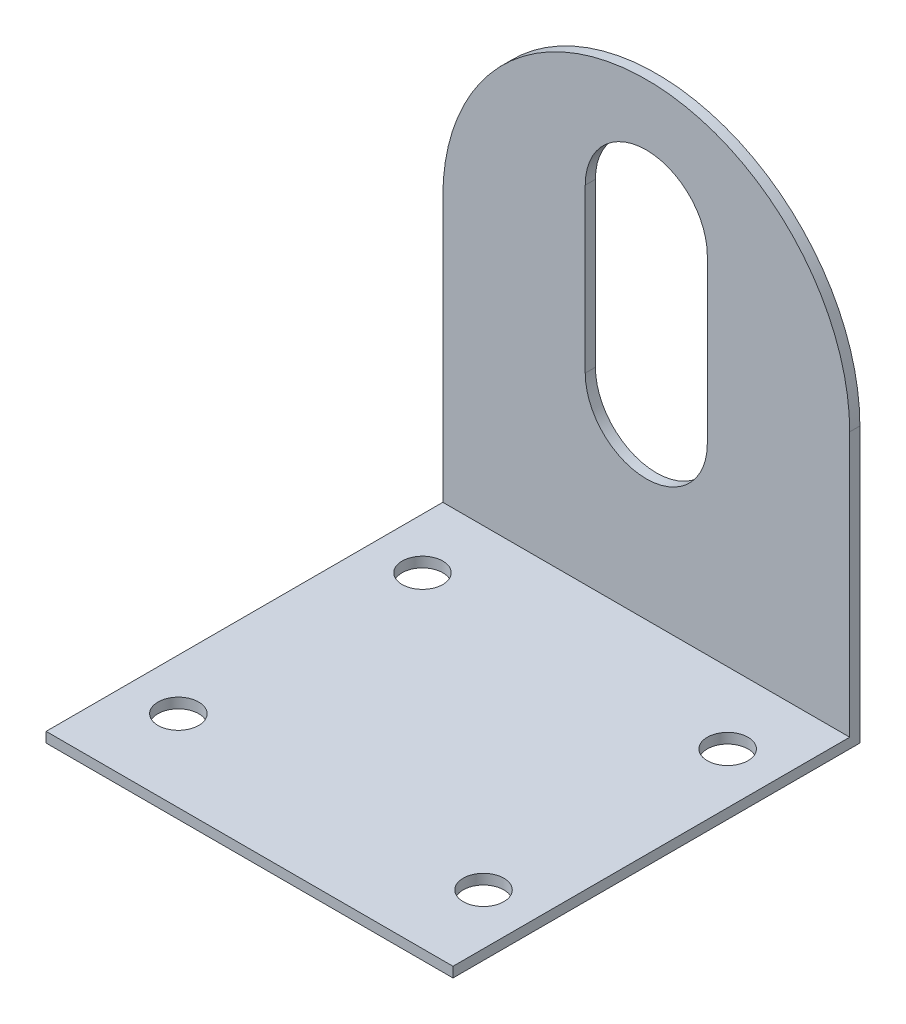
ISO-10303-21;
HEADER;
FILE_DESCRIPTION(('STEP AP214'),'2;1');
FILE_NAME('part.step','',(''),(''),'','','');
FILE_SCHEMA(('AUTOMOTIVE_DESIGN { 1 0 10303 214 1 1 1 1 }'));
ENDSEC;
DATA;
#1=APPLICATION_CONTEXT('core data for automotive mechanical design processes');
#2=APPLICATION_PROTOCOL_DEFINITION('international standard','automotive_design',2000,#1);
#3=PRODUCT_CONTEXT('',#1,'mechanical');
#4=PRODUCT('Part','Part','',(#3));
#5=PRODUCT_RELATED_PRODUCT_CATEGORY('part','',(#4));
#6=PRODUCT_DEFINITION_FORMATION('','',#4);
#7=PRODUCT_DEFINITION_CONTEXT('part definition',#1,'design');
#8=PRODUCT_DEFINITION('design','',#6,#7);
#9=PRODUCT_DEFINITION_SHAPE('','',#8);
#10=(LENGTH_UNIT() NAMED_UNIT(*) SI_UNIT(.MILLI.,.METRE.));
#11=(NAMED_UNIT(*) PLANE_ANGLE_UNIT() SI_UNIT($,.RADIAN.));
#12=(NAMED_UNIT(*) SI_UNIT($,.STERADIAN.) SOLID_ANGLE_UNIT());
#13=UNCERTAINTY_MEASURE_WITH_UNIT(LENGTH_MEASURE(1.E-05),#10,'distance_accuracy_value','');
#14=(GEOMETRIC_REPRESENTATION_CONTEXT(3) GLOBAL_UNCERTAINTY_ASSIGNED_CONTEXT((#13)) GLOBAL_UNIT_ASSIGNED_CONTEXT((#10,
#11,#12)) REPRESENTATION_CONTEXT('',''));
#15=CARTESIAN_POINT('',(0.,0.,0.));
#16=DIRECTION('',(0.,0.,1.));
#17=DIRECTION('',(1.,0.,0.));
#18=AXIS2_PLACEMENT_3D('',#15,#16,#17);
#19=CARTESIAN_POINT('',(20.,1.,-20.));
#20=DIRECTION('',(0.,0.,1.));
#21=DIRECTION('',(1.,0.,0.));
#22=AXIS2_PLACEMENT_3D('',#19,#20,#21);
#23=PLANE('',#22);
#24=CARTESIAN_POINT('',(0.,35.,-20.));
#25=DIRECTION('',(0.,0.,1.));
#26=DIRECTION('',(1.,0.,0.));
#27=AXIS2_PLACEMENT_3D('',#24,#25,#26);
#28=CIRCLE('',#27,6.);
#29=CARTESIAN_POINT('',(6.,35.,-20.));
#30=VERTEX_POINT('',#29);
#31=CARTESIAN_POINT('',(-6.,35.,-20.));
#32=VERTEX_POINT('',#31);
#33=EDGE_CURVE('E201',#30,#32,#28,.T.);
#34=ORIENTED_EDGE('',*,*,#33,.T.);
#35=DIRECTION('',(0.,-1.,0.));
#36=VECTOR('',#35,1.);
#37=CARTESIAN_POINT('',(-5.99999999999999,0.999999999999994,-20.));
#38=LINE('',#37,#36);
#39=CARTESIAN_POINT('',(-6.,19.,-20.));
#40=VERTEX_POINT('',#39);
#41=EDGE_CURVE('E204',#32,#40,#38,.T.);
#42=ORIENTED_EDGE('',*,*,#41,.T.);
#43=CARTESIAN_POINT('',(0.,19.,-20.));
#44=DIRECTION('',(0.,0.,1.));
#45=DIRECTION('',(1.,0.,0.));
#46=AXIS2_PLACEMENT_3D('',#43,#44,#45);
#47=CIRCLE('',#46,6.);
#48=CARTESIAN_POINT('',(6.,19.,-20.));
#49=VERTEX_POINT('',#48);
#50=EDGE_CURVE('E196',#40,#49,#47,.T.);
#51=ORIENTED_EDGE('',*,*,#50,.T.);
#52=DIRECTION('',(0.,-1.,0.));
#53=VECTOR('',#52,1.);
#54=CARTESIAN_POINT('',(6.,1.,-20.));
#55=LINE('',#54,#53);
#56=EDGE_CURVE('E176',#30,#49,#55,.T.);
#57=ORIENTED_EDGE('',*,*,#56,.F.);
#58=EDGE_LOOP('',(#34,#42,#51,#57));
#59=FACE_BOUND('',#58,.T.);
#60=CARTESIAN_POINT('',(0.,27.,-20.));
#61=DIRECTION('',(0.,0.,1.));
#62=DIRECTION('',(1.,0.,0.));
#63=AXIS2_PLACEMENT_3D('',#60,#61,#62);
#64=CIRCLE('',#63,20.);
#65=CARTESIAN_POINT('',(20.,27.,-20.));
#66=VERTEX_POINT('',#65);
#67=CARTESIAN_POINT('',(-20.,27.,-20.));
#68=VERTEX_POINT('',#67);
#69=EDGE_CURVE('E212',#66,#68,#64,.T.);
#70=ORIENTED_EDGE('',*,*,#69,.F.);
#71=DIRECTION('',(0.,-1.,0.));
#72=VECTOR('',#71,1.);
#73=CARTESIAN_POINT('',(20.,1.,-20.));
#74=LINE('',#73,#72);
#75=CARTESIAN_POINT('',(20.,0.,-20.));
#76=VERTEX_POINT('',#75);
#77=EDGE_CURVE('E265',#66,#76,#74,.T.);
#78=ORIENTED_EDGE('',*,*,#77,.T.);
#79=DIRECTION('',(-1.,0.,0.));
#80=VECTOR('',#79,1.);
#81=CARTESIAN_POINT('',(20.,0.,-20.));
#82=LINE('',#81,#80);
#83=CARTESIAN_POINT('',(-20.,0.,-20.));
#84=VERTEX_POINT('',#83);
#85=EDGE_CURVE('E249',#76,#84,#82,.T.);
#86=ORIENTED_EDGE('',*,*,#85,.T.);
#87=DIRECTION('',(0.,-1.,0.));
#88=VECTOR('',#87,1.);
#89=CARTESIAN_POINT('',(-20.,1.,-20.));
#90=LINE('',#89,#88);
#91=EDGE_CURVE('E254',#68,#84,#90,.T.);
#92=ORIENTED_EDGE('',*,*,#91,.F.);
#93=EDGE_LOOP('',(#70,#78,#86,#92));
#94=FACE_BOUND('',#93,.T.);
#95=ADVANCED_FACE('F93',(#59,#94),#23,.F.);
#96=CARTESIAN_POINT('',(-20.,47.,-19.));
#97=DIRECTION('',(0.,0.,-1.));
#98=DIRECTION('',(-1.,0.,0.));
#99=AXIS2_PLACEMENT_3D('',#96,#97,#98);
#100=PLANE('',#99);
#101=CARTESIAN_POINT('',(0.,19.,-19.));
#102=DIRECTION('',(0.,0.,1.));
#103=DIRECTION('',(1.,0.,0.));
#104=AXIS2_PLACEMENT_3D('',#101,#102,#103);
#105=CIRCLE('',#104,6.);
#106=CARTESIAN_POINT('',(-6.,19.,-19.));
#107=VERTEX_POINT('',#106);
#108=CARTESIAN_POINT('',(6.,19.,-19.));
#109=VERTEX_POINT('',#108);
#110=EDGE_CURVE('E182',#107,#109,#105,.T.);
#111=ORIENTED_EDGE('',*,*,#110,.F.);
#112=DIRECTION('',(0.,-1.,0.));
#113=VECTOR('',#112,1.);
#114=CARTESIAN_POINT('',(-5.99999999999999,0.,-19.));
#115=LINE('',#114,#113);
#116=CARTESIAN_POINT('',(-6.,35.,-19.));
#117=VERTEX_POINT('',#116);
#118=EDGE_CURVE('E116',#117,#107,#115,.T.);
#119=ORIENTED_EDGE('',*,*,#118,.F.);
#120=CARTESIAN_POINT('',(0.,35.,-19.));
#121=DIRECTION('',(0.,0.,1.));
#122=DIRECTION('',(1.,0.,0.));
#123=AXIS2_PLACEMENT_3D('',#120,#121,#122);
#124=CIRCLE('',#123,6.);
#125=CARTESIAN_POINT('',(6.,35.,-19.));
#126=VERTEX_POINT('',#125);
#127=EDGE_CURVE('E189',#126,#117,#124,.T.);
#128=ORIENTED_EDGE('',*,*,#127,.F.);
#129=DIRECTION('',(0.,-1.,0.));
#130=VECTOR('',#129,1.);
#131=CARTESIAN_POINT('',(6.,0.,-19.));
#132=LINE('',#131,#130);
#133=EDGE_CURVE('E173',#126,#109,#132,.T.);
#134=ORIENTED_EDGE('',*,*,#133,.T.);
#135=EDGE_LOOP('',(#111,#119,#128,#134));
#136=FACE_BOUND('',#135,.T.);
#137=DIRECTION('',(0.,-1.,0.));
#138=VECTOR('',#137,1.);
#139=CARTESIAN_POINT('',(20.,47.,-19.));
#140=LINE('',#139,#138);
#141=CARTESIAN_POINT('',(20.,27.,-19.));
#142=VERTEX_POINT('',#141);
#143=CARTESIAN_POINT('',(20.,1.,-19.));
#144=VERTEX_POINT('',#143);
#145=EDGE_CURVE('E217',#142,#144,#140,.T.);
#146=ORIENTED_EDGE('',*,*,#145,.F.);
#147=CARTESIAN_POINT('',(0.,27.,-19.));
#148=DIRECTION('',(0.,0.,1.));
#149=DIRECTION('',(1.,0.,0.));
#150=AXIS2_PLACEMENT_3D('',#147,#148,#149);
#151=CIRCLE('',#150,20.);
#152=CARTESIAN_POINT('',(-20.,27.,-19.));
#153=VERTEX_POINT('',#152);
#154=EDGE_CURVE('E207',#142,#153,#151,.T.);
#155=ORIENTED_EDGE('',*,*,#154,.T.);
#156=DIRECTION('',(0.,-1.,0.));
#157=VECTOR('',#156,1.);
#158=CARTESIAN_POINT('',(-20.,47.,-19.));
#159=LINE('',#158,#157);
#160=CARTESIAN_POINT('',(-20.,1.,-19.));
#161=VERTEX_POINT('',#160);
#162=EDGE_CURVE('E219',#153,#161,#159,.T.);
#163=ORIENTED_EDGE('',*,*,#162,.T.);
#164=DIRECTION('',(1.,0.,0.));
#165=VECTOR('',#164,1.);
#166=CARTESIAN_POINT('',(-20.,1.,-19.));
#167=LINE('',#166,#165);
#168=EDGE_CURVE('E214',#161,#144,#167,.T.);
#169=ORIENTED_EDGE('',*,*,#168,.T.);
#170=EDGE_LOOP('',(#146,#155,#163,#169));
#171=FACE_BOUND('',#170,.T.);
#172=ADVANCED_FACE('F186',(#136,#171),#100,.F.);
#173=CARTESIAN_POINT('',(-20.,1.,20.));
#174=DIRECTION('',(1.,0.,0.));
#175=DIRECTION('',(0.,0.,-1.));
#176=AXIS2_PLACEMENT_3D('',#173,#174,#175);
#177=PLANE('',#176);
#178=DIRECTION('',(0.,0.,1.));
#179=VECTOR('',#178,1.);
#180=CARTESIAN_POINT('',(-20.,27.,-65.));
#181=LINE('',#180,#179);
#182=EDGE_CURVE('E210',#68,#153,#181,.T.);
#183=ORIENTED_EDGE('',*,*,#182,.F.);
#184=ORIENTED_EDGE('',*,*,#91,.T.);
#185=DIRECTION('',(0.,0.,1.));
#186=VECTOR('',#185,1.);
#187=CARTESIAN_POINT('',(-20.,0.,20.));
#188=LINE('',#187,#186);
#189=CARTESIAN_POINT('',(-20.,0.,20.));
#190=VERTEX_POINT('',#189);
#191=EDGE_CURVE('E243',#84,#190,#188,.T.);
#192=ORIENTED_EDGE('',*,*,#191,.T.);
#193=DIRECTION('',(0.,-1.,0.));
#194=VECTOR('',#193,1.);
#195=CARTESIAN_POINT('',(-20.,1.,20.));
#196=LINE('',#195,#194);
#197=CARTESIAN_POINT('',(-20.,1.,20.));
#198=VERTEX_POINT('',#197);
#199=EDGE_CURVE('E101',#198,#190,#196,.T.);
#200=ORIENTED_EDGE('',*,*,#199,.F.);
#201=DIRECTION('',(0.,0.,1.));
#202=VECTOR('',#201,1.);
#203=CARTESIAN_POINT('',(-20.,1.,20.));
#204=LINE('',#203,#202);
#205=EDGE_CURVE('E246',#161,#198,#204,.T.);
#206=ORIENTED_EDGE('',*,*,#205,.F.);
#207=ORIENTED_EDGE('',*,*,#162,.F.);
#208=EDGE_LOOP('',(#183,#184,#192,#200,#206,#207));
#209=FACE_BOUND('',#208,.T.);
#210=ADVANCED_FACE('F95',(#209),#177,.F.);
#211=CARTESIAN_POINT('',(0.,1.,0.));
#212=DIRECTION('',(0.,1.,0.));
#213=DIRECTION('',(0.,0.,1.));
#214=AXIS2_PLACEMENT_3D('',#211,#212,#213);
#215=PLANE('',#214);
#216=ORIENTED_EDGE('',*,*,#168,.F.);
#217=ORIENTED_EDGE('',*,*,#205,.T.);
#218=DIRECTION('',(1.,0.,0.));
#219=VECTOR('',#218,1.);
#220=CARTESIAN_POINT('',(20.,1.,20.));
#221=LINE('',#220,#219);
#222=CARTESIAN_POINT('',(20.,1.,20.));
#223=VERTEX_POINT('',#222);
#224=EDGE_CURVE('E248',#198,#223,#221,.T.);
#225=ORIENTED_EDGE('',*,*,#224,.T.);
#226=DIRECTION('',(0.,0.,-1.));
#227=VECTOR('',#226,1.);
#228=CARTESIAN_POINT('',(20.,1.,20.));
#229=LINE('',#228,#227);
#230=EDGE_CURVE('E251',#223,#144,#229,.T.);
#231=ORIENTED_EDGE('',*,*,#230,.T.);
#232=EDGE_LOOP('',(#216,#217,#225,#231));
#233=FACE_BOUND('',#232,.T.);
#234=CARTESIAN_POINT('',(15.,1.,-12.));
#235=DIRECTION('',(0.,1.,0.));
#236=DIRECTION('',(0.,0.,1.));
#237=AXIS2_PLACEMENT_3D('',#234,#235,#236);
#238=CIRCLE('',#237,2.);
#239=CARTESIAN_POINT('',(15.,1.,-9.99999999999999));
#240=VERTEX_POINT('',#239);
#241=EDGE_CURVE('E228',#240,#240,#238,.T.);
#242=ORIENTED_EDGE('',*,*,#241,.F.);
#243=EDGE_LOOP('',(#242));
#244=FACE_BOUND('',#243,.T.);
#245=CARTESIAN_POINT('',(-15.,1.,12.));
#246=DIRECTION('',(0.,1.,0.));
#247=DIRECTION('',(0.,0.,1.));
#248=AXIS2_PLACEMENT_3D('',#245,#246,#247);
#249=CIRCLE('',#248,2.);
#250=CARTESIAN_POINT('',(-15.,1.,14.));
#251=VERTEX_POINT('',#250);
#252=EDGE_CURVE('E240',#251,#251,#249,.T.);
#253=ORIENTED_EDGE('',*,*,#252,.F.);
#254=EDGE_LOOP('',(#253));
#255=FACE_BOUND('',#254,.T.);
#256=CARTESIAN_POINT('',(15.,1.,12.));
#257=DIRECTION('',(0.,1.,0.));
#258=DIRECTION('',(0.,0.,1.));
#259=AXIS2_PLACEMENT_3D('',#256,#257,#258);
#260=CIRCLE('',#259,2.00000000000001);
#261=CARTESIAN_POINT('',(15.,1.,14.));
#262=VERTEX_POINT('',#261);
#263=EDGE_CURVE('E234',#262,#262,#260,.T.);
#264=ORIENTED_EDGE('',*,*,#263,.F.);
#265=EDGE_LOOP('',(#264));
#266=FACE_BOUND('',#265,.T.);
#267=CARTESIAN_POINT('',(-15.,1.,-12.));
#268=DIRECTION('',(0.,1.,0.));
#269=DIRECTION('',(0.,0.,1.));
#270=AXIS2_PLACEMENT_3D('',#267,#268,#269);
#271=CIRCLE('',#270,2.);
#272=CARTESIAN_POINT('',(-15.,1.,-10.));
#273=VERTEX_POINT('',#272);
#274=EDGE_CURVE('E222',#273,#273,#271,.T.);
#275=ORIENTED_EDGE('',*,*,#274,.F.);
#276=EDGE_LOOP('',(#275));
#277=FACE_BOUND('',#276,.T.);
#278=ADVANCED_FACE('F292',(#233,#244,#255,#266,#277),#215,.T.);
#279=CARTESIAN_POINT('',(0.,0.,0.));
#280=DIRECTION('',(0.,1.,0.));
#281=DIRECTION('',(0.,0.,1.));
#282=AXIS2_PLACEMENT_3D('',#279,#280,#281);
#283=PLANE('',#282);
#284=ORIENTED_EDGE('',*,*,#191,.F.);
#285=ORIENTED_EDGE('',*,*,#85,.F.);
#286=DIRECTION('',(0.,0.,-1.));
#287=VECTOR('',#286,1.);
#288=CARTESIAN_POINT('',(20.,0.,20.));
#289=LINE('',#288,#287);
#290=CARTESIAN_POINT('',(20.,0.,20.));
#291=VERTEX_POINT('',#290);
#292=EDGE_CURVE('E259',#291,#76,#289,.T.);
#293=ORIENTED_EDGE('',*,*,#292,.F.);
#294=DIRECTION('',(1.,0.,0.));
#295=VECTOR('',#294,1.);
#296=CARTESIAN_POINT('',(20.,0.,20.));
#297=LINE('',#296,#295);
#298=EDGE_CURVE('E257',#190,#291,#297,.T.);
#299=ORIENTED_EDGE('',*,*,#298,.F.);
#300=EDGE_LOOP('',(#284,#285,#293,#299));
#301=FACE_BOUND('',#300,.T.);
#302=CARTESIAN_POINT('',(-15.,0.,12.));
#303=DIRECTION('',(0.,1.,0.));
#304=DIRECTION('',(0.,0.,1.));
#305=AXIS2_PLACEMENT_3D('',#302,#303,#304);
#306=CIRCLE('',#305,2.);
#307=CARTESIAN_POINT('',(-15.,0.,14.));
#308=VERTEX_POINT('',#307);
#309=EDGE_CURVE('E237',#308,#308,#306,.T.);
#310=ORIENTED_EDGE('',*,*,#309,.T.);
#311=EDGE_LOOP('',(#310));
#312=FACE_BOUND('',#311,.T.);
#313=CARTESIAN_POINT('',(15.,0.,12.));
#314=DIRECTION('',(0.,1.,0.));
#315=DIRECTION('',(0.,0.,1.));
#316=AXIS2_PLACEMENT_3D('',#313,#314,#315);
#317=CIRCLE('',#316,2.00000000000001);
#318=CARTESIAN_POINT('',(15.,0.,14.));
#319=VERTEX_POINT('',#318);
#320=EDGE_CURVE('E231',#319,#319,#317,.T.);
#321=ORIENTED_EDGE('',*,*,#320,.T.);
#322=EDGE_LOOP('',(#321));
#323=FACE_BOUND('',#322,.T.);
#324=CARTESIAN_POINT('',(15.,0.,-12.));
#325=DIRECTION('',(0.,1.,0.));
#326=DIRECTION('',(0.,0.,1.));
#327=AXIS2_PLACEMENT_3D('',#324,#325,#326);
#328=CIRCLE('',#327,2.);
#329=CARTESIAN_POINT('',(15.,0.,-9.99999999999999));
#330=VERTEX_POINT('',#329);
#331=EDGE_CURVE('E225',#330,#330,#328,.T.);
#332=ORIENTED_EDGE('',*,*,#331,.T.);
#333=EDGE_LOOP('',(#332));
#334=FACE_BOUND('',#333,.T.);
#335=CARTESIAN_POINT('',(-15.,0.,-12.));
#336=DIRECTION('',(0.,1.,0.));
#337=DIRECTION('',(0.,0.,1.));
#338=AXIS2_PLACEMENT_3D('',#335,#336,#337);
#339=CIRCLE('',#338,2.);
#340=CARTESIAN_POINT('',(-15.,0.,-10.));
#341=VERTEX_POINT('',#340);
#342=EDGE_CURVE('E221',#341,#341,#339,.T.);
#343=ORIENTED_EDGE('',*,*,#342,.T.);
#344=EDGE_LOOP('',(#343));
#345=FACE_BOUND('',#344,.T.);
#346=ADVANCED_FACE('F282',(#301,#312,#323,#334,#345),#283,.F.);
#347=CARTESIAN_POINT('',(20.,1.,20.));
#348=DIRECTION('',(0.,0.,-1.));
#349=DIRECTION('',(-1.,0.,0.));
#350=AXIS2_PLACEMENT_3D('',#347,#348,#349);
#351=PLANE('',#350);
#352=ORIENTED_EDGE('',*,*,#298,.T.);
#353=DIRECTION('',(0.,-1.,0.));
#354=VECTOR('',#353,1.);
#355=CARTESIAN_POINT('',(20.,1.,20.));
#356=LINE('',#355,#354);
#357=EDGE_CURVE('E267',#223,#291,#356,.T.);
#358=ORIENTED_EDGE('',*,*,#357,.F.);
#359=ORIENTED_EDGE('',*,*,#224,.F.);
#360=ORIENTED_EDGE('',*,*,#199,.T.);
#361=EDGE_LOOP('',(#352,#358,#359,#360));
#362=FACE_BOUND('',#361,.T.);
#363=ADVANCED_FACE('F273',(#362),#351,.F.);
#364=CARTESIAN_POINT('',(20.,1.,20.));
#365=DIRECTION('',(-1.,0.,0.));
#366=DIRECTION('',(0.,0.,1.));
#367=AXIS2_PLACEMENT_3D('',#364,#365,#366);
#368=PLANE('',#367);
#369=ORIENTED_EDGE('',*,*,#77,.F.);
#370=DIRECTION('',(0.,0.,1.));
#371=VECTOR('',#370,1.);
#372=CARTESIAN_POINT('',(20.,27.,-65.));
#373=LINE('',#372,#371);
#374=EDGE_CURVE('E12',#66,#142,#373,.T.);
#375=ORIENTED_EDGE('',*,*,#374,.T.);
#376=ORIENTED_EDGE('',*,*,#145,.T.);
#377=ORIENTED_EDGE('',*,*,#230,.F.);
#378=ORIENTED_EDGE('',*,*,#357,.T.);
#379=ORIENTED_EDGE('',*,*,#292,.T.);
#380=EDGE_LOOP('',(#369,#375,#376,#377,#378,#379));
#381=FACE_BOUND('',#380,.T.);
#382=ADVANCED_FACE('F287',(#381),#368,.F.);
#383=CARTESIAN_POINT('',(-15.,1.,12.));
#384=DIRECTION('',(0.,-1.,0.));
#385=DIRECTION('',(0.,0.,-1.));
#386=AXIS2_PLACEMENT_3D('',#383,#384,#385);
#387=CYLINDRICAL_SURFACE('',#386,2.);
#388=ORIENTED_EDGE('',*,*,#252,.T.);
#389=EDGE_LOOP('',(#388));
#390=FACE_BOUND('',#389,.T.);
#391=ORIENTED_EDGE('',*,*,#309,.F.);
#392=EDGE_LOOP('',(#391));
#393=FACE_BOUND('',#392,.T.);
#394=ADVANCED_FACE('F323',(#390,#393),#387,.F.);
#395=CARTESIAN_POINT('',(15.,1.,12.));
#396=DIRECTION('',(0.,-1.,0.));
#397=DIRECTION('',(0.,0.,-1.));
#398=AXIS2_PLACEMENT_3D('',#395,#396,#397);
#399=CYLINDRICAL_SURFACE('',#398,2.00000000000001);
#400=ORIENTED_EDGE('',*,*,#263,.T.);
#401=EDGE_LOOP('',(#400));
#402=FACE_BOUND('',#401,.T.);
#403=ORIENTED_EDGE('',*,*,#320,.F.);
#404=EDGE_LOOP('',(#403));
#405=FACE_BOUND('',#404,.T.);
#406=ADVANCED_FACE('F337',(#402,#405),#399,.F.);
#407=CARTESIAN_POINT('',(15.,1.,-12.));
#408=DIRECTION('',(0.,-1.,0.));
#409=DIRECTION('',(0.,0.,-1.));
#410=AXIS2_PLACEMENT_3D('',#407,#408,#409);
#411=CYLINDRICAL_SURFACE('',#410,2.);
#412=ORIENTED_EDGE('',*,*,#241,.T.);
#413=EDGE_LOOP('',(#412));
#414=FACE_BOUND('',#413,.T.);
#415=ORIENTED_EDGE('',*,*,#331,.F.);
#416=EDGE_LOOP('',(#415));
#417=FACE_BOUND('',#416,.T.);
#418=ADVANCED_FACE('F309',(#414,#417),#411,.F.);
#419=CARTESIAN_POINT('',(-15.,1.,-12.));
#420=DIRECTION('',(0.,-1.,0.));
#421=DIRECTION('',(0.,0.,-1.));
#422=AXIS2_PLACEMENT_3D('',#419,#420,#421);
#423=CYLINDRICAL_SURFACE('',#422,2.);
#424=ORIENTED_EDGE('',*,*,#274,.T.);
#425=EDGE_LOOP('',(#424));
#426=FACE_BOUND('',#425,.T.);
#427=ORIENTED_EDGE('',*,*,#342,.F.);
#428=EDGE_LOOP('',(#427));
#429=FACE_BOUND('',#428,.T.);
#430=ADVANCED_FACE('F301',(#426,#429),#423,.F.);
#431=CARTESIAN_POINT('',(0.,27.,-65.));
#432=DIRECTION('',(0.,0.,1.));
#433=DIRECTION('',(1.,0.,0.));
#434=AXIS2_PLACEMENT_3D('',#431,#432,#433);
#435=CYLINDRICAL_SURFACE('',#434,20.);
#436=ORIENTED_EDGE('',*,*,#69,.T.);
#437=ORIENTED_EDGE('',*,*,#182,.T.);
#438=ORIENTED_EDGE('',*,*,#154,.F.);
#439=ORIENTED_EDGE('',*,*,#374,.F.);
#440=EDGE_LOOP('',(#436,#437,#438,#439));
#441=FACE_BOUND('',#440,.T.);
#442=ADVANCED_FACE('F298',(#441),#435,.T.);
#443=CARTESIAN_POINT('',(-5.99999999999999,0.,-65.));
#444=DIRECTION('',(-1.,0.,0.));
#445=DIRECTION('',(0.,-1.,0.));
#446=AXIS2_PLACEMENT_3D('',#443,#444,#445);
#447=PLANE('',#446);
#448=DIRECTION('',(0.,0.,1.));
#449=VECTOR('',#448,1.);
#450=CARTESIAN_POINT('',(-6.,35.,-65.));
#451=LINE('',#450,#449);
#452=EDGE_CURVE('E194',#32,#117,#451,.T.);
#453=ORIENTED_EDGE('',*,*,#452,.T.);
#454=ORIENTED_EDGE('',*,*,#118,.T.);
#455=DIRECTION('',(0.,0.,1.));
#456=VECTOR('',#455,1.);
#457=CARTESIAN_POINT('',(-6.,19.,-65.));
#458=LINE('',#457,#456);
#459=EDGE_CURVE('E179',#40,#107,#458,.T.);
#460=ORIENTED_EDGE('',*,*,#459,.F.);
#461=ORIENTED_EDGE('',*,*,#41,.F.);
#462=EDGE_LOOP('',(#453,#454,#460,#461));
#463=FACE_BOUND('',#462,.T.);
#464=ADVANCED_FACE('F300',(#463),#447,.F.);
#465=CARTESIAN_POINT('',(0.,35.,-65.));
#466=DIRECTION('',(0.,0.,1.));
#467=DIRECTION('',(1.,0.,0.));
#468=AXIS2_PLACEMENT_3D('',#465,#466,#467);
#469=CYLINDRICAL_SURFACE('',#468,6.);
#470=DIRECTION('',(0.,0.,1.));
#471=VECTOR('',#470,1.);
#472=CARTESIAN_POINT('',(6.,35.,-65.));
#473=LINE('',#472,#471);
#474=EDGE_CURVE('E178',#30,#126,#473,.T.);
#475=ORIENTED_EDGE('',*,*,#474,.T.);
#476=ORIENTED_EDGE('',*,*,#127,.T.);
#477=ORIENTED_EDGE('',*,*,#452,.F.);
#478=ORIENTED_EDGE('',*,*,#33,.F.);
#479=EDGE_LOOP('',(#475,#476,#477,#478));
#480=FACE_BOUND('',#479,.T.);
#481=ADVANCED_FACE('F307',(#480),#469,.F.);
#482=CARTESIAN_POINT('',(6.,0.,-65.));
#483=DIRECTION('',(-1.,0.,0.));
#484=DIRECTION('',(0.,0.,1.));
#485=AXIS2_PLACEMENT_3D('',#482,#483,#484);
#486=PLANE('',#485);
#487=ORIENTED_EDGE('',*,*,#56,.T.);
#488=DIRECTION('',(0.,0.,1.));
#489=VECTOR('',#488,1.);
#490=CARTESIAN_POINT('',(6.,19.,-65.));
#491=LINE('',#490,#489);
#492=EDGE_CURVE('E108',#49,#109,#491,.T.);
#493=ORIENTED_EDGE('',*,*,#492,.T.);
#494=ORIENTED_EDGE('',*,*,#133,.F.);
#495=ORIENTED_EDGE('',*,*,#474,.F.);
#496=EDGE_LOOP('',(#487,#493,#494,#495));
#497=FACE_BOUND('',#496,.T.);
#498=ADVANCED_FACE('F170',(#497),#486,.T.);
#499=CARTESIAN_POINT('',(0.,19.,-65.));
#500=DIRECTION('',(0.,0.,1.));
#501=DIRECTION('',(1.,0.,0.));
#502=AXIS2_PLACEMENT_3D('',#499,#500,#501);
#503=CYLINDRICAL_SURFACE('',#502,6.);
#504=ORIENTED_EDGE('',*,*,#459,.T.);
#505=ORIENTED_EDGE('',*,*,#110,.T.);
#506=ORIENTED_EDGE('',*,*,#492,.F.);
#507=ORIENTED_EDGE('',*,*,#50,.F.);
#508=EDGE_LOOP('',(#504,#505,#506,#507));
#509=FACE_BOUND('',#508,.T.);
#510=ADVANCED_FACE('F183',(#509),#503,.F.);
#511=CLOSED_SHELL('',(#95,#172,#210,#278,#346,#363,#382,#394,#406,#418,#430,#442,#464,#481,#498,#510));
#512=MANIFOLD_SOLID_BREP('B2',#511);
#513=ADVANCED_BREP_SHAPE_REPRESENTATION('',(#18,#512),#14);
#514=SHAPE_DEFINITION_REPRESENTATION(#9,#513);
ENDSEC;
END-ISO-10303-21;
